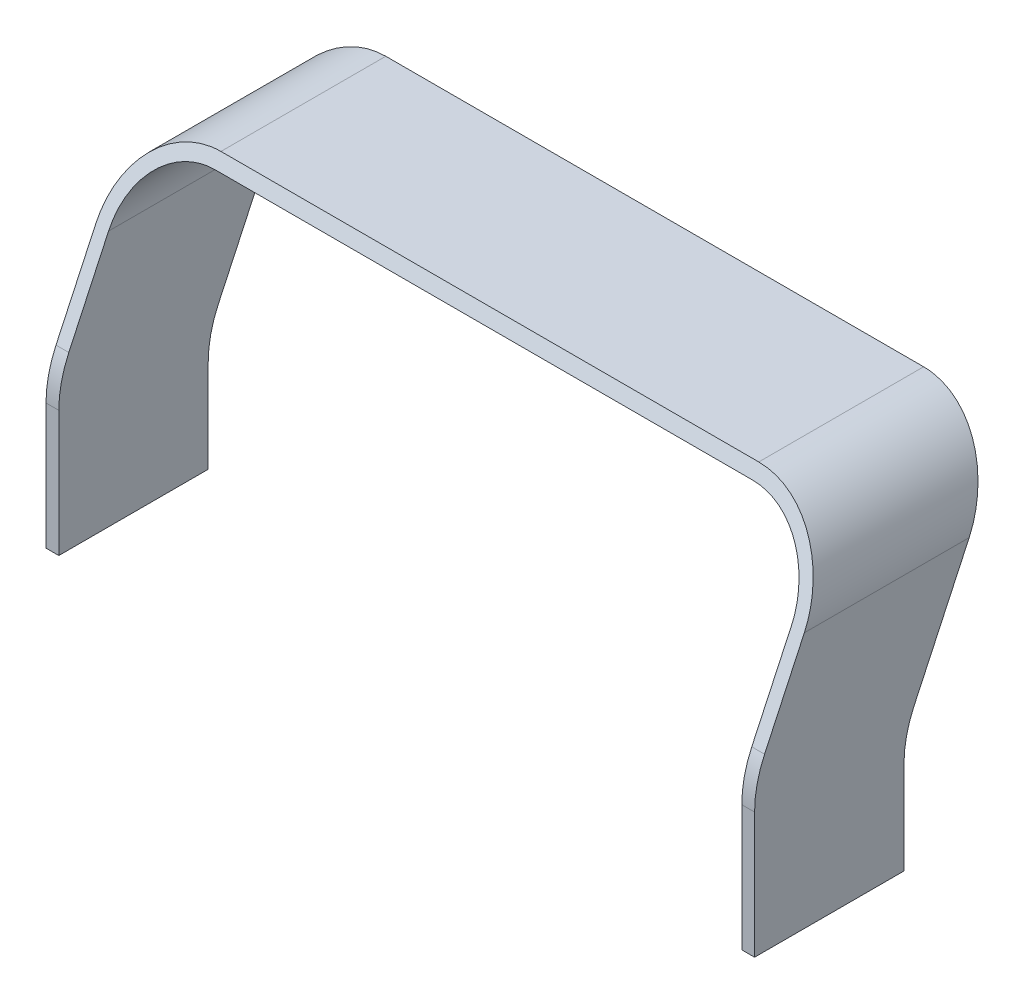
ISO-10303-21;
HEADER;
FILE_DESCRIPTION(('STEP AP214'),'2;1');
FILE_NAME('part.step','',(''),(''),'','','');
FILE_SCHEMA(('AUTOMOTIVE_DESIGN { 1 0 10303 214 1 1 1 1 }'));
ENDSEC;
DATA;
#1=APPLICATION_CONTEXT('core data for automotive mechanical design processes');
#2=APPLICATION_PROTOCOL_DEFINITION('international standard','automotive_design',2000,#1);
#3=PRODUCT_CONTEXT('',#1,'mechanical');
#4=PRODUCT('Part','Part','',(#3));
#5=PRODUCT_RELATED_PRODUCT_CATEGORY('part','',(#4));
#6=PRODUCT_DEFINITION_FORMATION('','',#4);
#7=PRODUCT_DEFINITION_CONTEXT('part definition',#1,'design');
#8=PRODUCT_DEFINITION('design','',#6,#7);
#9=PRODUCT_DEFINITION_SHAPE('','',#8);
#10=(LENGTH_UNIT() NAMED_UNIT(*) SI_UNIT(.MILLI.,.METRE.));
#11=(NAMED_UNIT(*) PLANE_ANGLE_UNIT() SI_UNIT($,.RADIAN.));
#12=(NAMED_UNIT(*) SI_UNIT($,.STERADIAN.) SOLID_ANGLE_UNIT());
#13=UNCERTAINTY_MEASURE_WITH_UNIT(LENGTH_MEASURE(1.E-05),#10,'distance_accuracy_value','');
#14=(GEOMETRIC_REPRESENTATION_CONTEXT(3) GLOBAL_UNCERTAINTY_ASSIGNED_CONTEXT((#13)) GLOBAL_UNIT_ASSIGNED_CONTEXT((#10,
#11,#12)) REPRESENTATION_CONTEXT('',''));
#15=CARTESIAN_POINT('',(0.,0.,0.));
#16=DIRECTION('',(0.,0.,1.));
#17=DIRECTION('',(1.,0.,0.));
#18=AXIS2_PLACEMENT_3D('',#15,#16,#17);
#19=CARTESIAN_POINT('',(-63.,65.,70.));
#20=DIRECTION('',(0.,0.,-1.));
#21=DIRECTION('',(-1.,0.,0.));
#22=AXIS2_PLACEMENT_3D('',#19,#20,#21);
#23=CYLINDRICAL_SURFACE('',#22,17.);
#24=CARTESIAN_POINT('',(-63.,65.,28.2070418011814));
#25=DIRECTION('',(0.,0.,1.));
#26=DIRECTION('',(0.,-1.,0.));
#27=AXIS2_PLACEMENT_3D('',#24,#25,#26);
#28=CIRCLE('',#27,17.);
#29=CARTESIAN_POINT('',(-79.2913524074985,69.8571428571429,28.2070418011814));
#30=VERTEX_POINT('',#29);
#31=CARTESIAN_POINT('',(-63.,82.,28.2070418011814));
#32=VERTEX_POINT('',#31);
#33=EDGE_CURVE('E52',#30,#32,#28,.F.);
#34=ORIENTED_EDGE('',*,*,#33,.F.);
#35=DIRECTION('',(0.,0.,-1.));
#36=VECTOR('',#35,1.);
#37=CARTESIAN_POINT('',(-79.2913524074985,69.8571428571429,70.));
#38=LINE('',#37,#36);
#39=CARTESIAN_POINT('',(-79.2913524074985,69.8571428571429,31.2070418011814));
#40=VERTEX_POINT('',#39);
#41=EDGE_CURVE('E320',#30,#40,#38,.F.);
#42=ORIENTED_EDGE('',*,*,#41,.T.);
#43=CARTESIAN_POINT('',(-63.,65.,31.2070418011814));
#44=DIRECTION('',(0.,0.,-1.));
#45=DIRECTION('',(-1.,0.,0.));
#46=AXIS2_PLACEMENT_3D('',#43,#44,#45);
#47=CIRCLE('',#46,17.);
#48=CARTESIAN_POINT('',(-63.,82.,31.2070418011814));
#49=VERTEX_POINT('',#48);
#50=EDGE_CURVE('E59',#49,#40,#47,.F.);
#51=ORIENTED_EDGE('',*,*,#50,.F.);
#52=DIRECTION('',(0.,0.,-1.));
#53=VECTOR('',#52,1.);
#54=CARTESIAN_POINT('',(-63.,82.,70.));
#55=LINE('',#54,#53);
#56=CARTESIAN_POINT('',(-63.,82.,50.41507835749));
#57=VERTEX_POINT('',#56);
#58=EDGE_CURVE('E268',#57,#49,#55,.T.);
#59=ORIENTED_EDGE('',*,*,#58,.F.);
#60=CARTESIAN_POINT('',(-63.,65.,58.342308546125));
#61=DIRECTION('',(0.,-0.422618261740701,-0.906307787036649));
#62=DIRECTION('',(0.,0.906307787036649,-0.422618261740701));
#63=AXIS2_PLACEMENT_3D('',#60,#61,#62);
#64=ELLIPSE('',#63,18.7574246223624,17.);
#65=CARTESIAN_POINT('',(-80.,65.,58.342308546125));
#66=VERTEX_POINT('',#65);
#67=EDGE_CURVE('E377',#57,#66,#64,.F.);
#68=ORIENTED_EDGE('',*,*,#67,.T.);
#69=DIRECTION('',(0.,0.,-1.));
#70=VECTOR('',#69,1.);
#71=CARTESIAN_POINT('',(-80.,65.,70.));
#72=LINE('',#71,#70);
#73=CARTESIAN_POINT('',(-80.,65.,19.7240813824378));
#74=VERTEX_POINT('',#73);
#75=EDGE_CURVE('E271',#66,#74,#72,.T.);
#76=ORIENTED_EDGE('',*,*,#75,.T.);
#77=CARTESIAN_POINT('',(-63.,65.,19.7240813824377));
#78=DIRECTION('',(0.,0.422618261740701,0.906307787036649));
#79=DIRECTION('',(0.,0.906307787036649,-0.422618261740701));
#80=AXIS2_PLACEMENT_3D('',#77,#78,#79);
#81=ELLIPSE('',#80,18.7574246223624,17.);
#82=CARTESIAN_POINT('',(-63.,82.,11.7968511938027));
#83=VERTEX_POINT('',#82);
#84=EDGE_CURVE('E403',#74,#83,#81,.F.);
#85=ORIENTED_EDGE('',*,*,#84,.T.);
#86=EDGE_CURVE('E267',#32,#83,#55,.T.);
#87=ORIENTED_EDGE('',*,*,#86,.F.);
#88=EDGE_LOOP('',(#34,#42,#51,#59,#68,#76,#85,#87));
#89=FACE_BOUND('',#88,.T.);
#90=ADVANCED_FACE('F37',(#89),#23,.F.);
#91=CARTESIAN_POINT('',(-63.,82.,70.));
#92=DIRECTION('',(0.,1.,0.));
#93=DIRECTION('',(0.,0.,1.));
#94=AXIS2_PLACEMENT_3D('',#91,#92,#93);
#95=PLANE('',#94);
#96=DIRECTION('',(-1.,0.,0.));
#97=VECTOR('',#96,1.);
#98=CARTESIAN_POINT('',(-63.,82.,31.2070418011814));
#99=LINE('',#98,#97);
#100=CARTESIAN_POINT('',(63.0000000000003,82.,31.2070418011814));
#101=VERTEX_POINT('',#100);
#102=EDGE_CURVE('E338',#101,#49,#99,.T.);
#103=ORIENTED_EDGE('',*,*,#102,.F.);
#104=DIRECTION('',(0.,0.,-1.));
#105=VECTOR('',#104,1.);
#106=CARTESIAN_POINT('',(63.0000000000003,82.,70.));
#107=LINE('',#106,#105);
#108=CARTESIAN_POINT('',(63.0000000000003,82.,50.41507835749));
#109=VERTEX_POINT('',#108);
#110=EDGE_CURVE('E264',#109,#101,#107,.T.);
#111=ORIENTED_EDGE('',*,*,#110,.F.);
#112=DIRECTION('',(-1.,0.,0.));
#113=VECTOR('',#112,1.);
#114=CARTESIAN_POINT('',(-63.,82.,50.41507835749));
#115=LINE('',#114,#113);
#116=EDGE_CURVE('E344',#109,#57,#115,.T.);
#117=ORIENTED_EDGE('',*,*,#116,.T.);
#118=ORIENTED_EDGE('',*,*,#58,.T.);
#119=EDGE_LOOP('',(#103,#111,#117,#118));
#120=FACE_BOUND('',#119,.T.);
#121=ADVANCED_FACE('F342',(#120),#95,.F.);
#122=DIRECTION('',(1.,0.,0.));
#123=VECTOR('',#122,1.);
#124=CARTESIAN_POINT('',(-63.,82.,28.2070418011814));
#125=LINE('',#124,#123);
#126=CARTESIAN_POINT('',(63.0000000000003,82.,28.2070418011813));
#127=VERTEX_POINT('',#126);
#128=EDGE_CURVE('E484',#32,#127,#125,.T.);
#129=ORIENTED_EDGE('',*,*,#128,.F.);
#130=ORIENTED_EDGE('',*,*,#86,.T.);
#131=DIRECTION('',(1.,0.,0.));
#132=VECTOR('',#131,1.);
#133=CARTESIAN_POINT('',(-63.,82.,11.7968511938027));
#134=LINE('',#133,#132);
#135=CARTESIAN_POINT('',(63.0000000000003,82.,11.7968511938027));
#136=VERTEX_POINT('',#135);
#137=EDGE_CURVE('E400',#83,#136,#134,.T.);
#138=ORIENTED_EDGE('',*,*,#137,.T.);
#139=EDGE_CURVE('E263',#127,#136,#107,.T.);
#140=ORIENTED_EDGE('',*,*,#139,.F.);
#141=EDGE_LOOP('',(#129,#130,#138,#140));
#142=FACE_BOUND('',#141,.T.);
#143=ADVANCED_FACE('F483',(#142),#95,.F.);
#144=CARTESIAN_POINT('',(63.0000000000003,65.,70.));
#145=DIRECTION('',(0.,0.,-1.));
#146=DIRECTION('',(-1.,0.,0.));
#147=AXIS2_PLACEMENT_3D('',#144,#145,#146);
#148=CYLINDRICAL_SURFACE('',#147,17.);
#149=CARTESIAN_POINT('',(63.0000000000003,65.,31.2070418011814));
#150=DIRECTION('',(0.,0.,-1.));
#151=DIRECTION('',(-1.,0.,0.));
#152=AXIS2_PLACEMENT_3D('',#149,#150,#151);
#153=CIRCLE('',#152,17.);
#154=CARTESIAN_POINT('',(79.2913524074987,69.8571428571429,31.2070418011814));
#155=VERTEX_POINT('',#154);
#156=EDGE_CURVE('E347',#155,#101,#153,.F.);
#157=ORIENTED_EDGE('',*,*,#156,.F.);
#158=DIRECTION('',(0.,0.,-1.));
#159=VECTOR('',#158,1.);
#160=CARTESIAN_POINT('',(79.2913524074987,69.8571428571429,70.));
#161=LINE('',#160,#159);
#162=CARTESIAN_POINT('',(79.2913524074987,69.8571428571429,28.2070418011814));
#163=VERTEX_POINT('',#162);
#164=EDGE_CURVE('E317',#155,#163,#161,.T.);
#165=ORIENTED_EDGE('',*,*,#164,.T.);
#166=CARTESIAN_POINT('',(63.0000000000003,65.,28.2070418011814));
#167=DIRECTION('',(0.,0.,1.));
#168=DIRECTION('',(0.,-1.,0.));
#169=AXIS2_PLACEMENT_3D('',#166,#167,#168);
#170=CIRCLE('',#169,17.);
#171=EDGE_CURVE('E530',#127,#163,#170,.F.);
#172=ORIENTED_EDGE('',*,*,#171,.F.);
#173=ORIENTED_EDGE('',*,*,#139,.T.);
#174=CARTESIAN_POINT('',(63.0000000000003,65.,19.7240813824378));
#175=DIRECTION('',(0.,0.422618261740701,0.906307787036649));
#176=DIRECTION('',(0.,0.906307787036649,-0.422618261740701));
#177=AXIS2_PLACEMENT_3D('',#174,#175,#176);
#178=ELLIPSE('',#177,18.7574246223624,17.);
#179=CARTESIAN_POINT('',(80.0000000000003,65.,19.7240813824378));
#180=VERTEX_POINT('',#179);
#181=EDGE_CURVE('E397',#136,#180,#178,.F.);
#182=ORIENTED_EDGE('',*,*,#181,.T.);
#183=DIRECTION('',(0.,0.,-1.));
#184=VECTOR('',#183,1.);
#185=CARTESIAN_POINT('',(80.0000000000003,65.,70.));
#186=LINE('',#185,#184);
#187=CARTESIAN_POINT('',(80.0000000000003,65.,58.342308546125));
#188=VERTEX_POINT('',#187);
#189=EDGE_CURVE('E260',#188,#180,#186,.T.);
#190=ORIENTED_EDGE('',*,*,#189,.F.);
#191=CARTESIAN_POINT('',(63.0000000000003,65.,58.342308546125));
#192=DIRECTION('',(0.,-0.422618261740701,-0.906307787036649));
#193=DIRECTION('',(0.,0.906307787036649,-0.422618261740701));
#194=AXIS2_PLACEMENT_3D('',#191,#192,#193);
#195=ELLIPSE('',#194,18.7574246223624,17.);
#196=EDGE_CURVE('E373',#188,#109,#195,.F.);
#197=ORIENTED_EDGE('',*,*,#196,.T.);
#198=ORIENTED_EDGE('',*,*,#110,.T.);
#199=EDGE_LOOP('',(#157,#165,#172,#173,#182,#190,#197,#198));
#200=FACE_BOUND('',#199,.T.);
#201=ADVANCED_FACE('F477',(#200),#148,.F.);
#202=CARTESIAN_POINT('',(-63.,65.,70.));
#203=DIRECTION('',(0.,0.,-1.));
#204=DIRECTION('',(-1.,0.,0.));
#205=AXIS2_PLACEMENT_3D('',#202,#203,#204);
#206=PLANE('',#205);
#207=DIRECTION('',(0.,1.,0.));
#208=VECTOR('',#207,1.);
#209=CARTESIAN_POINT('',(83.0000000000003,64.9999999999999,70.));
#210=LINE('',#209,#208);
#211=CARTESIAN_POINT('',(83.0000000000003,5.,70.));
#212=VERTEX_POINT('',#211);
#213=CARTESIAN_POINT('',(83.0000000000003,34.4576334339265,70.));
#214=VERTEX_POINT('',#213);
#215=EDGE_CURVE('E418',#212,#214,#210,.T.);
#216=ORIENTED_EDGE('',*,*,#215,.T.);
#217=DIRECTION('',(-1.,0.,0.));
#218=VECTOR('',#217,1.);
#219=CARTESIAN_POINT('',(-63.,34.4576334339265,70.));
#220=LINE('',#219,#218);
#221=CARTESIAN_POINT('',(80.0000000000003,34.4576334339265,70.));
#222=VERTEX_POINT('',#221);
#223=EDGE_CURVE('E285',#214,#222,#220,.T.);
#224=ORIENTED_EDGE('',*,*,#223,.T.);
#225=DIRECTION('',(0.,-1.,0.));
#226=VECTOR('',#225,1.);
#227=CARTESIAN_POINT('',(80.0000000000003,65.,70.));
#228=LINE('',#227,#226);
#229=CARTESIAN_POINT('',(80.0000000000003,5.00000000000001,70.));
#230=VERTEX_POINT('',#229);
#231=EDGE_CURVE('E414',#222,#230,#228,.T.);
#232=ORIENTED_EDGE('',*,*,#231,.T.);
#233=DIRECTION('',(1.,0.,0.));
#234=VECTOR('',#233,1.);
#235=CARTESIAN_POINT('',(80.0000000000003,5.00000000000001,70.));
#236=LINE('',#235,#234);
#237=EDGE_CURVE('E416',#230,#212,#236,.T.);
#238=ORIENTED_EDGE('',*,*,#237,.T.);
#239=EDGE_LOOP('',(#216,#224,#232,#238));
#240=FACE_BOUND('',#239,.T.);
#241=ADVANCED_FACE('F468',(#240),#206,.F.);
#242=CARTESIAN_POINT('',(-83.,4.99999999999997,70.));
#243=DIRECTION('',(0.,1.,0.));
#244=DIRECTION('',(-1.,0.,0.));
#245=AXIS2_PLACEMENT_3D('',#242,#243,#244);
#246=PLANE('',#245);
#247=DIRECTION('',(0.,0.,-1.));
#248=VECTOR('',#247,1.);
#249=CARTESIAN_POINT('',(-83.,4.99999999999997,70.));
#250=LINE('',#249,#248);
#251=CARTESIAN_POINT('',(-83.,4.99999999999997,70.));
#252=VERTEX_POINT('',#251);
#253=CARTESIAN_POINT('',(-83.,4.99999999999997,35.));
#254=VERTEX_POINT('',#253);
#255=EDGE_CURVE('E241',#252,#254,#250,.T.);
#256=ORIENTED_EDGE('',*,*,#255,.T.);
#257=DIRECTION('',(1.,0.,0.));
#258=VECTOR('',#257,1.);
#259=CARTESIAN_POINT('',(-83.,4.99999999999997,35.));
#260=LINE('',#259,#258);
#261=CARTESIAN_POINT('',(-80.,5.00000000000001,35.));
#262=VERTEX_POINT('',#261);
#263=EDGE_CURVE('E234',#254,#262,#260,.T.);
#264=ORIENTED_EDGE('',*,*,#263,.T.);
#265=DIRECTION('',(0.,0.,-1.));
#266=VECTOR('',#265,1.);
#267=CARTESIAN_POINT('',(-80.,5.00000000000001,70.));
#268=LINE('',#267,#266);
#269=CARTESIAN_POINT('',(-80.,5.00000000000001,70.));
#270=VERTEX_POINT('',#269);
#271=EDGE_CURVE('E274',#270,#262,#268,.T.);
#272=ORIENTED_EDGE('',*,*,#271,.F.);
#273=DIRECTION('',(1.,0.,0.));
#274=VECTOR('',#273,1.);
#275=CARTESIAN_POINT('',(-83.,4.99999999999997,70.));
#276=LINE('',#275,#274);
#277=EDGE_CURVE('E408',#252,#270,#276,.T.);
#278=ORIENTED_EDGE('',*,*,#277,.F.);
#279=EDGE_LOOP('',(#256,#264,#272,#278));
#280=FACE_BOUND('',#279,.T.);
#281=ADVANCED_FACE('F428',(#280),#246,.F.);
#282=CARTESIAN_POINT('',(-80.,5.00000000000001,70.));
#283=DIRECTION('',(-1.,0.,0.));
#284=DIRECTION('',(0.,0.,1.));
#285=AXIS2_PLACEMENT_3D('',#282,#283,#284);
#286=PLANE('',#285);
#287=DIRECTION('',(0.,-0.906307787036649,0.422618261740701));
#288=VECTOR('',#287,1.);
#289=CARTESIAN_POINT('',(-80.,11.2512168304856,83.4057777545822));
#290=LINE('',#289,#288);
#291=CARTESIAN_POINT('',(-80.,45.023089977444,67.6576946759162));
#292=VERTEX_POINT('',#291);
#293=EDGE_CURVE('E379',#66,#292,#290,.T.);
#294=ORIENTED_EDGE('',*,*,#293,.T.);
#295=CARTESIAN_POINT('',(-80.,34.4576334339265,45.));
#296=DIRECTION('',(-1.,0.,0.));
#297=DIRECTION('',(0.,0.,1.));
#298=AXIS2_PLACEMENT_3D('',#295,#296,#297);
#299=CIRCLE('',#298,25.);
#300=CARTESIAN_POINT('',(-80.,34.4576334339265,70.));
#301=VERTEX_POINT('',#300);
#302=EDGE_CURVE('E301',#292,#301,#299,.F.);
#303=ORIENTED_EDGE('',*,*,#302,.T.);
#304=DIRECTION('',(0.,1.,0.));
#305=VECTOR('',#304,1.);
#306=CARTESIAN_POINT('',(-80.,5.00000000000001,70.));
#307=LINE('',#306,#305);
#308=EDGE_CURVE('E411',#270,#301,#307,.T.);
#309=ORIENTED_EDGE('',*,*,#308,.F.);
#310=ORIENTED_EDGE('',*,*,#271,.T.);
#311=DIRECTION('',(0.,1.,0.));
#312=VECTOR('',#311,1.);
#313=CARTESIAN_POINT('',(-80.,5.00000000000001,35.));
#314=LINE('',#313,#312);
#315=CARTESIAN_POINT('',(-80.,26.6983202414236,35.));
#316=VERTEX_POINT('',#315);
#317=EDGE_CURVE('E387',#262,#316,#314,.T.);
#318=ORIENTED_EDGE('',*,*,#317,.T.);
#319=CARTESIAN_POINT('',(-80.,26.6983202414236,10.));
#320=DIRECTION('',(-1.,0.,0.));
#321=DIRECTION('',(0.,0.,1.));
#322=AXIS2_PLACEMENT_3D('',#319,#320,#321);
#323=CIRCLE('',#322,25.);
#324=CARTESIAN_POINT('',(-80.,37.2637767849411,32.6576946759162));
#325=VERTEX_POINT('',#324);
#326=EDGE_CURVE('E309',#316,#325,#323,.T.);
#327=ORIENTED_EDGE('',*,*,#326,.T.);
#328=DIRECTION('',(0.,0.906307787036649,-0.422618261740701));
#329=VECTOR('',#328,1.);
#330=CARTESIAN_POINT('',(-80.,-3.54042233043891,51.6850052082995));
#331=LINE('',#330,#329);
#332=EDGE_CURVE('E406',#325,#74,#331,.T.);
#333=ORIENTED_EDGE('',*,*,#332,.T.);
#334=ORIENTED_EDGE('',*,*,#75,.F.);
#335=EDGE_LOOP('',(#294,#303,#309,#310,#318,#327,#333,#334));
#336=FACE_BOUND('',#335,.T.);
#337=ADVANCED_FACE('F430',(#336),#286,.F.);
#338=CARTESIAN_POINT('',(80.0000000000003,65.,70.));
#339=DIRECTION('',(1.,0.,0.));
#340=DIRECTION('',(0.,1.,0.));
#341=AXIS2_PLACEMENT_3D('',#338,#339,#340);
#342=PLANE('',#341);
#343=ORIENTED_EDGE('',*,*,#231,.F.);
#344=CARTESIAN_POINT('',(80.0000000000003,34.4576334339265,45.));
#345=DIRECTION('',(1.,0.,0.));
#346=DIRECTION('',(0.,1.,0.));
#347=AXIS2_PLACEMENT_3D('',#344,#345,#346);
#348=CIRCLE('',#347,25.);
#349=CARTESIAN_POINT('',(80.0000000000003,45.023089977444,67.6576946759162));
#350=VERTEX_POINT('',#349);
#351=EDGE_CURVE('E288',#222,#350,#348,.F.);
#352=ORIENTED_EDGE('',*,*,#351,.T.);
#353=DIRECTION('',(0.,0.906307787036649,-0.422618261740701));
#354=VECTOR('',#353,1.);
#355=CARTESIAN_POINT('',(80.0000000000003,60.5348451210817,60.4244444610128));
#356=LINE('',#355,#354);
#357=EDGE_CURVE('E371',#350,#188,#356,.T.);
#358=ORIENTED_EDGE('',*,*,#357,.T.);
#359=ORIENTED_EDGE('',*,*,#189,.T.);
#360=DIRECTION('',(0.,-0.906307787036649,0.422618261740701));
#361=VECTOR('',#360,1.);
#362=CARTESIAN_POINT('',(80.0000000000003,45.7432059601572,28.70367191473));
#363=LINE('',#362,#361);
#364=CARTESIAN_POINT('',(80.0000000000003,37.2637767849411,32.6576946759162));
#365=VERTEX_POINT('',#364);
#366=EDGE_CURVE('E394',#180,#365,#363,.T.);
#367=ORIENTED_EDGE('',*,*,#366,.T.);
#368=CARTESIAN_POINT('',(80.0000000000003,26.6983202414236,10.));
#369=DIRECTION('',(1.,0.,0.));
#370=DIRECTION('',(0.,1.,0.));
#371=AXIS2_PLACEMENT_3D('',#368,#369,#370);
#372=CIRCLE('',#371,25.);
#373=CARTESIAN_POINT('',(80.0000000000003,26.6983202414236,35.));
#374=VERTEX_POINT('',#373);
#375=EDGE_CURVE('E303',#365,#374,#372,.T.);
#376=ORIENTED_EDGE('',*,*,#375,.T.);
#377=DIRECTION('',(0.,-1.,0.));
#378=VECTOR('',#377,1.);
#379=CARTESIAN_POINT('',(80.0000000000003,65.,35.));
#380=LINE('',#379,#378);
#381=CARTESIAN_POINT('',(80.0000000000003,5.00000000000001,35.));
#382=VERTEX_POINT('',#381);
#383=EDGE_CURVE('E385',#374,#382,#380,.T.);
#384=ORIENTED_EDGE('',*,*,#383,.T.);
#385=DIRECTION('',(0.,0.,-1.));
#386=VECTOR('',#385,1.);
#387=CARTESIAN_POINT('',(80.0000000000003,5.00000000000001,70.));
#388=LINE('',#387,#386);
#389=EDGE_CURVE('E257',#230,#382,#388,.T.);
#390=ORIENTED_EDGE('',*,*,#389,.F.);
#391=EDGE_LOOP('',(#343,#352,#358,#359,#367,#376,#384,#390));
#392=FACE_BOUND('',#391,.T.);
#393=ADVANCED_FACE('F458',(#392),#342,.F.);
#394=CARTESIAN_POINT('',(80.0000000000003,5.00000000000001,70.));
#395=DIRECTION('',(0.,1.,0.));
#396=DIRECTION('',(-1.,0.,0.));
#397=AXIS2_PLACEMENT_3D('',#394,#395,#396);
#398=PLANE('',#397);
#399=ORIENTED_EDGE('',*,*,#389,.T.);
#400=DIRECTION('',(1.,0.,0.));
#401=VECTOR('',#400,1.);
#402=CARTESIAN_POINT('',(80.0000000000003,5.00000000000001,35.));
#403=LINE('',#402,#401);
#404=CARTESIAN_POINT('',(83.0000000000003,5.,35.));
#405=VERTEX_POINT('',#404);
#406=EDGE_CURVE('E382',#382,#405,#403,.T.);
#407=ORIENTED_EDGE('',*,*,#406,.T.);
#408=DIRECTION('',(0.,0.,-1.));
#409=VECTOR('',#408,1.);
#410=CARTESIAN_POINT('',(83.0000000000003,5.,70.));
#411=LINE('',#410,#409);
#412=EDGE_CURVE('E254',#212,#405,#411,.T.);
#413=ORIENTED_EDGE('',*,*,#412,.F.);
#414=ORIENTED_EDGE('',*,*,#237,.F.);
#415=EDGE_LOOP('',(#399,#407,#413,#414));
#416=FACE_BOUND('',#415,.T.);
#417=ADVANCED_FACE('F466',(#416),#398,.F.);
#418=CARTESIAN_POINT('',(83.0000000000003,64.9999999999999,70.));
#419=DIRECTION('',(-1.,0.,0.));
#420=DIRECTION('',(0.,-1.,0.));
#421=AXIS2_PLACEMENT_3D('',#418,#419,#420);
#422=PLANE('',#421);
#423=DIRECTION('',(0.,-0.906307787036649,0.422618261740701));
#424=VECTOR('',#423,1.);
#425=CARTESIAN_POINT('',(83.0000000000003,85.,49.016155383025));
#426=LINE('',#425,#424);
#427=CARTESIAN_POINT('',(83.0000000000003,65.,58.342308546125));
#428=VERTEX_POINT('',#427);
#429=CARTESIAN_POINT('',(83.0000000000003,45.023089977444,67.6576946759162));
#430=VERTEX_POINT('',#429);
#431=EDGE_CURVE('E352',#428,#430,#426,.T.);
#432=ORIENTED_EDGE('',*,*,#431,.T.);
#433=CARTESIAN_POINT('',(83.0000000000003,34.4576334339265,45.));
#434=DIRECTION('',(-1.,0.,0.));
#435=DIRECTION('',(0.,-1.,0.));
#436=AXIS2_PLACEMENT_3D('',#433,#434,#435);
#437=CIRCLE('',#436,25.);
#438=EDGE_CURVE('E294',#430,#214,#437,.F.);
#439=ORIENTED_EDGE('',*,*,#438,.T.);
#440=ORIENTED_EDGE('',*,*,#215,.F.);
#441=ORIENTED_EDGE('',*,*,#412,.T.);
#442=DIRECTION('',(0.,1.,0.));
#443=VECTOR('',#442,1.);
#444=CARTESIAN_POINT('',(83.0000000000003,32.2406868074971,35.));
#445=LINE('',#444,#443);
#446=CARTESIAN_POINT('',(83.0000000000003,26.6983202414236,35.));
#447=VERTEX_POINT('',#446);
#448=EDGE_CURVE('E223',#405,#447,#445,.T.);
#449=ORIENTED_EDGE('',*,*,#448,.T.);
#450=CARTESIAN_POINT('',(83.0000000000003,26.6983202414236,10.));
#451=DIRECTION('',(-1.,0.,0.));
#452=DIRECTION('',(0.,-1.,0.));
#453=AXIS2_PLACEMENT_3D('',#450,#451,#452);
#454=CIRCLE('',#453,25.);
#455=CARTESIAN_POINT('',(83.0000000000003,37.2637767849411,32.6576946759162));
#456=VERTEX_POINT('',#455);
#457=EDGE_CURVE('E305',#447,#456,#454,.T.);
#458=ORIENTED_EDGE('',*,*,#457,.T.);
#459=DIRECTION('',(0.,0.906307787036649,-0.422618261740701));
#460=VECTOR('',#459,1.);
#461=CARTESIAN_POINT('',(83.0000000000003,85.,10.3979282193377));
#462=LINE('',#461,#460);
#463=CARTESIAN_POINT('',(83.0000000000003,65.,19.7240813824378));
#464=VERTEX_POINT('',#463);
#465=EDGE_CURVE('E362',#456,#464,#462,.T.);
#466=ORIENTED_EDGE('',*,*,#465,.T.);
#467=DIRECTION('',(0.,0.,-1.));
#468=VECTOR('',#467,1.);
#469=CARTESIAN_POINT('',(83.0000000000003,64.9999999999999,70.));
#470=LINE('',#469,#468);
#471=EDGE_CURVE('E251',#428,#464,#470,.T.);
#472=ORIENTED_EDGE('',*,*,#471,.F.);
#473=EDGE_LOOP('',(#432,#439,#440,#441,#449,#458,#466,#472));
#474=FACE_BOUND('',#473,.T.);
#475=ADVANCED_FACE('F448',(#474),#422,.F.);
#476=CARTESIAN_POINT('',(63.0000000000003,65.,70.));
#477=DIRECTION('',(0.,0.,-1.));
#478=DIRECTION('',(-1.,0.,0.));
#479=AXIS2_PLACEMENT_3D('',#476,#477,#478);
#480=CYLINDRICAL_SURFACE('',#479,20.);
#481=CARTESIAN_POINT('',(63.0000000000003,65.,19.7240813824378));
#482=DIRECTION('',(0.,0.422618261740701,0.906307787036649));
#483=DIRECTION('',(0.,0.906307787036649,-0.422618261740701));
#484=AXIS2_PLACEMENT_3D('',#481,#482,#483);
#485=ELLIPSE('',#484,22.0675583792499,20.);
#486=CARTESIAN_POINT('',(63.0000000000001,85.,10.3979282193377));
#487=VERTEX_POINT('',#486);
#488=EDGE_CURVE('E233',#464,#487,#485,.T.);
#489=ORIENTED_EDGE('',*,*,#488,.T.);
#490=DIRECTION('',(0.,0.,-1.));
#491=VECTOR('',#490,1.);
#492=CARTESIAN_POINT('',(63.0000000000001,85.,70.));
#493=LINE('',#492,#491);
#494=CARTESIAN_POINT('',(63.0000000000001,85.,49.016155383025));
#495=VERTEX_POINT('',#494);
#496=EDGE_CURVE('E243',#495,#487,#493,.T.);
#497=ORIENTED_EDGE('',*,*,#496,.F.);
#498=CARTESIAN_POINT('',(63.0000000000003,65.,58.342308546125));
#499=DIRECTION('',(0.,-0.422618261740701,-0.906307787036649));
#500=DIRECTION('',(0.,0.906307787036649,-0.422618261740701));
#501=AXIS2_PLACEMENT_3D('',#498,#499,#500);
#502=ELLIPSE('',#501,22.0675583792499,20.);
#503=EDGE_CURVE('E368',#495,#428,#502,.T.);
#504=ORIENTED_EDGE('',*,*,#503,.T.);
#505=ORIENTED_EDGE('',*,*,#471,.T.);
#506=EDGE_LOOP('',(#489,#497,#504,#505));
#507=FACE_BOUND('',#506,.T.);
#508=ADVANCED_FACE('F445',(#507),#480,.T.);
#509=CARTESIAN_POINT('',(-62.9999999999999,85.,70.));
#510=DIRECTION('',(0.,-1.,0.));
#511=DIRECTION('',(0.,0.,-1.));
#512=AXIS2_PLACEMENT_3D('',#509,#510,#511);
#513=PLANE('',#512);
#514=DIRECTION('',(-1.,0.,0.));
#515=VECTOR('',#514,1.);
#516=CARTESIAN_POINT('',(83.0000000000003,85.,10.3979282193377));
#517=LINE('',#516,#515);
#518=CARTESIAN_POINT('',(-63.,85.,10.3979282193377));
#519=VERTEX_POINT('',#518);
#520=EDGE_CURVE('E357',#487,#519,#517,.T.);
#521=ORIENTED_EDGE('',*,*,#520,.T.);
#522=DIRECTION('',(0.,0.,-1.));
#523=VECTOR('',#522,1.);
#524=CARTESIAN_POINT('',(-62.9999999999999,85.,70.));
#525=LINE('',#524,#523);
#526=CARTESIAN_POINT('',(-63.,85.,49.016155383025));
#527=VERTEX_POINT('',#526);
#528=EDGE_CURVE('E232',#527,#519,#525,.T.);
#529=ORIENTED_EDGE('',*,*,#528,.F.);
#530=DIRECTION('',(-1.,0.,0.));
#531=VECTOR('',#530,1.);
#532=CARTESIAN_POINT('',(83.0000000000003,85.,49.016155383025));
#533=LINE('',#532,#531);
#534=EDGE_CURVE('E355',#495,#527,#533,.T.);
#535=ORIENTED_EDGE('',*,*,#534,.F.);
#536=ORIENTED_EDGE('',*,*,#496,.T.);
#537=EDGE_LOOP('',(#521,#529,#535,#536));
#538=FACE_BOUND('',#537,.T.);
#539=ADVANCED_FACE('F441',(#538),#513,.F.);
#540=CARTESIAN_POINT('',(-63.,65.,70.));
#541=DIRECTION('',(0.,0.,-1.));
#542=DIRECTION('',(-1.,0.,0.));
#543=AXIS2_PLACEMENT_3D('',#540,#541,#542);
#544=CYLINDRICAL_SURFACE('',#543,20.);
#545=ORIENTED_EDGE('',*,*,#528,.T.);
#546=CARTESIAN_POINT('',(-63.,65.,19.7240813824377));
#547=DIRECTION('',(0.,0.422618261740701,0.906307787036649));
#548=DIRECTION('',(0.,0.906307787036649,-0.422618261740701));
#549=AXIS2_PLACEMENT_3D('',#546,#547,#548);
#550=ELLIPSE('',#549,22.0675583792498,20.);
#551=CARTESIAN_POINT('',(-83.,64.9999999999999,19.7240813824378));
#552=VERTEX_POINT('',#551);
#553=EDGE_CURVE('E216',#519,#552,#550,.T.);
#554=ORIENTED_EDGE('',*,*,#553,.T.);
#555=DIRECTION('',(0.,0.,-1.));
#556=VECTOR('',#555,1.);
#557=CARTESIAN_POINT('',(-83.,64.9999999999999,70.));
#558=LINE('',#557,#556);
#559=CARTESIAN_POINT('',(-83.,64.9999999999999,58.3423085461251));
#560=VERTEX_POINT('',#559);
#561=EDGE_CURVE('E230',#560,#552,#558,.T.);
#562=ORIENTED_EDGE('',*,*,#561,.F.);
#563=CARTESIAN_POINT('',(-63.,65.,58.342308546125));
#564=DIRECTION('',(0.,-0.422618261740701,-0.906307787036649));
#565=DIRECTION('',(0.,0.906307787036649,-0.422618261740701));
#566=AXIS2_PLACEMENT_3D('',#563,#564,#565);
#567=ELLIPSE('',#566,22.0675583792498,20.);
#568=EDGE_CURVE('E359',#560,#527,#567,.T.);
#569=ORIENTED_EDGE('',*,*,#568,.T.);
#570=EDGE_LOOP('',(#545,#554,#562,#569));
#571=FACE_BOUND('',#570,.T.);
#572=ADVANCED_FACE('F228',(#571),#544,.T.);
#573=CARTESIAN_POINT('',(-83.,4.99999999999997,70.));
#574=DIRECTION('',(1.,0.,0.));
#575=DIRECTION('',(0.,0.,-1.));
#576=AXIS2_PLACEMENT_3D('',#573,#574,#575);
#577=PLANE('',#576);
#578=DIRECTION('',(0.,-1.,0.));
#579=VECTOR('',#578,1.);
#580=CARTESIAN_POINT('',(-83.,4.99999999999997,70.));
#581=LINE('',#580,#579);
#582=CARTESIAN_POINT('',(-83.,34.4576334339265,70.));
#583=VERTEX_POINT('',#582);
#584=EDGE_CURVE('E246',#583,#252,#581,.T.);
#585=ORIENTED_EDGE('',*,*,#584,.F.);
#586=CARTESIAN_POINT('',(-83.,34.4576334339265,45.));
#587=DIRECTION('',(1.,0.,0.));
#588=DIRECTION('',(0.,0.,-1.));
#589=AXIS2_PLACEMENT_3D('',#586,#587,#588);
#590=CIRCLE('',#589,25.);
#591=CARTESIAN_POINT('',(-83.,45.023089977444,67.6576946759162));
#592=VERTEX_POINT('',#591);
#593=EDGE_CURVE('E299',#583,#592,#590,.F.);
#594=ORIENTED_EDGE('',*,*,#593,.T.);
#595=DIRECTION('',(0.,-0.906307787036649,0.422618261740701));
#596=VECTOR('',#595,1.);
#597=CARTESIAN_POINT('',(-83.,85.,49.016155383025));
#598=LINE('',#597,#596);
#599=EDGE_CURVE('E240',#560,#592,#598,.T.);
#600=ORIENTED_EDGE('',*,*,#599,.F.);
#601=ORIENTED_EDGE('',*,*,#561,.T.);
#602=DIRECTION('',(0.,0.906307787036649,-0.422618261740701));
#603=VECTOR('',#602,1.);
#604=CARTESIAN_POINT('',(-83.,85.,10.3979282193377));
#605=LINE('',#604,#603);
#606=CARTESIAN_POINT('',(-83.,37.2637767849411,32.6576946759162));
#607=VERTEX_POINT('',#606);
#608=EDGE_CURVE('E211',#607,#552,#605,.T.);
#609=ORIENTED_EDGE('',*,*,#608,.F.);
#610=CARTESIAN_POINT('',(-83.,26.6983202414236,10.));
#611=DIRECTION('',(1.,0.,0.));
#612=DIRECTION('',(0.,0.,-1.));
#613=AXIS2_PLACEMENT_3D('',#610,#611,#612);
#614=CIRCLE('',#613,25.);
#615=CARTESIAN_POINT('',(-83.,26.6983202414236,35.));
#616=VERTEX_POINT('',#615);
#617=EDGE_CURVE('E307',#607,#616,#614,.T.);
#618=ORIENTED_EDGE('',*,*,#617,.T.);
#619=DIRECTION('',(0.,1.,0.));
#620=VECTOR('',#619,1.);
#621=CARTESIAN_POINT('',(-83.,32.2406868074971,35.));
#622=LINE('',#621,#620);
#623=EDGE_CURVE('E224',#254,#616,#622,.T.);
#624=ORIENTED_EDGE('',*,*,#623,.F.);
#625=ORIENTED_EDGE('',*,*,#255,.F.);
#626=EDGE_LOOP('',(#585,#594,#600,#601,#609,#618,#624,#625));
#627=FACE_BOUND('',#626,.T.);
#628=ADVANCED_FACE('F238',(#627),#577,.F.);
#629=ORIENTED_EDGE('',*,*,#308,.T.);
#630=DIRECTION('',(-1.,0.,0.));
#631=VECTOR('',#630,1.);
#632=CARTESIAN_POINT('',(-63.,34.4576334339265,70.));
#633=LINE('',#632,#631);
#634=EDGE_CURVE('E296',#301,#583,#633,.T.);
#635=ORIENTED_EDGE('',*,*,#634,.T.);
#636=ORIENTED_EDGE('',*,*,#584,.T.);
#637=ORIENTED_EDGE('',*,*,#277,.T.);
#638=EDGE_LOOP('',(#629,#635,#636,#637));
#639=FACE_BOUND('',#638,.T.);
#640=ADVANCED_FACE('F422',(#639),#206,.F.);
#641=CARTESIAN_POINT('',(83.0000000000003,85.,49.016155383025));
#642=DIRECTION('',(0.,-0.422618261740701,-0.906307787036649));
#643=DIRECTION('',(0.,0.906307787036649,-0.422618261740701));
#644=AXIS2_PLACEMENT_3D('',#641,#642,#643);
#645=PLANE('',#644);
#646=ORIENTED_EDGE('',*,*,#357,.F.);
#647=DIRECTION('',(-1.,0.,0.));
#648=VECTOR('',#647,1.);
#649=CARTESIAN_POINT('',(83.0000000000003,45.023089977444,67.6576946759162));
#650=LINE('',#649,#648);
#651=EDGE_CURVE('E292',#350,#430,#650,.F.);
#652=ORIENTED_EDGE('',*,*,#651,.T.);
#653=ORIENTED_EDGE('',*,*,#431,.F.);
#654=ORIENTED_EDGE('',*,*,#503,.F.);
#655=ORIENTED_EDGE('',*,*,#534,.T.);
#656=ORIENTED_EDGE('',*,*,#568,.F.);
#657=ORIENTED_EDGE('',*,*,#599,.T.);
#658=DIRECTION('',(-1.,0.,0.));
#659=VECTOR('',#658,1.);
#660=CARTESIAN_POINT('',(83.0000000000003,45.023089977444,67.6576946759162));
#661=LINE('',#660,#659);
#662=EDGE_CURVE('E290',#592,#292,#661,.F.);
#663=ORIENTED_EDGE('',*,*,#662,.T.);
#664=ORIENTED_EDGE('',*,*,#293,.F.);
#665=ORIENTED_EDGE('',*,*,#67,.F.);
#666=ORIENTED_EDGE('',*,*,#116,.F.);
#667=ORIENTED_EDGE('',*,*,#196,.F.);
#668=EDGE_LOOP('',(#646,#652,#653,#654,#655,#656,#657,#663,#664,#665,#666,#667));
#669=FACE_BOUND('',#668,.T.);
#670=ADVANCED_FACE('F438',(#669),#645,.F.);
#671=CARTESIAN_POINT('',(83.0000000000003,85.,10.3979282193377));
#672=DIRECTION('',(0.,0.422618261740701,0.906307787036649));
#673=DIRECTION('',(0.,-0.906307787036649,0.422618261740701));
#674=AXIS2_PLACEMENT_3D('',#671,#672,#673);
#675=PLANE('',#674);
#676=ORIENTED_EDGE('',*,*,#465,.F.);
#677=DIRECTION('',(-1.,0.,0.));
#678=VECTOR('',#677,1.);
#679=CARTESIAN_POINT('',(80.0000000000003,37.2637767849411,32.6576946759162));
#680=LINE('',#679,#678);
#681=EDGE_CURVE('E278',#456,#365,#680,.T.);
#682=ORIENTED_EDGE('',*,*,#681,.T.);
#683=ORIENTED_EDGE('',*,*,#366,.F.);
#684=ORIENTED_EDGE('',*,*,#181,.F.);
#685=ORIENTED_EDGE('',*,*,#137,.F.);
#686=ORIENTED_EDGE('',*,*,#84,.F.);
#687=ORIENTED_EDGE('',*,*,#332,.F.);
#688=DIRECTION('',(-1.,0.,0.));
#689=VECTOR('',#688,1.);
#690=CARTESIAN_POINT('',(-82.9999999999999,37.2637767849411,32.6576946759162));
#691=LINE('',#690,#689);
#692=EDGE_CURVE('E220',#325,#607,#691,.T.);
#693=ORIENTED_EDGE('',*,*,#692,.T.);
#694=ORIENTED_EDGE('',*,*,#608,.T.);
#695=ORIENTED_EDGE('',*,*,#553,.F.);
#696=ORIENTED_EDGE('',*,*,#520,.F.);
#697=ORIENTED_EDGE('',*,*,#488,.F.);
#698=EDGE_LOOP('',(#676,#682,#683,#684,#685,#686,#687,#693,#694,#695,#696,#697));
#699=FACE_BOUND('',#698,.T.);
#700=ADVANCED_FACE('F214',(#699),#675,.F.);
#701=CARTESIAN_POINT('',(83.0000000000003,32.2406868074971,35.));
#702=DIRECTION('',(0.,0.,1.));
#703=DIRECTION('',(1.,0.,0.));
#704=AXIS2_PLACEMENT_3D('',#701,#702,#703);
#705=PLANE('',#704);
#706=ORIENTED_EDGE('',*,*,#623,.T.);
#707=DIRECTION('',(-1.,0.,0.));
#708=VECTOR('',#707,1.);
#709=CARTESIAN_POINT('',(-79.9999999999999,26.6983202414236,35.));
#710=LINE('',#709,#708);
#711=EDGE_CURVE('E283',#616,#316,#710,.F.);
#712=ORIENTED_EDGE('',*,*,#711,.T.);
#713=ORIENTED_EDGE('',*,*,#317,.F.);
#714=ORIENTED_EDGE('',*,*,#263,.F.);
#715=EDGE_LOOP('',(#706,#712,#713,#714));
#716=FACE_BOUND('',#715,.T.);
#717=ADVANCED_FACE('F490',(#716),#705,.F.);
#718=ORIENTED_EDGE('',*,*,#383,.F.);
#719=DIRECTION('',(-1.,0.,0.));
#720=VECTOR('',#719,1.);
#721=CARTESIAN_POINT('',(83.0000000000003,26.6983202414236,35.));
#722=LINE('',#721,#720);
#723=EDGE_CURVE('E281',#374,#447,#722,.F.);
#724=ORIENTED_EDGE('',*,*,#723,.T.);
#725=ORIENTED_EDGE('',*,*,#448,.F.);
#726=ORIENTED_EDGE('',*,*,#406,.F.);
#727=EDGE_LOOP('',(#718,#724,#725,#726));
#728=FACE_BOUND('',#727,.T.);
#729=ADVANCED_FACE('F462',(#728),#705,.F.);
#730=CARTESIAN_POINT('',(83.0000000000003,26.6983202414236,10.));
#731=DIRECTION('',(1.,0.,0.));
#732=DIRECTION('',(0.,0.,-1.));
#733=AXIS2_PLACEMENT_3D('',#730,#731,#732);
#734=CYLINDRICAL_SURFACE('',#733,25.);
#735=ORIENTED_EDGE('',*,*,#457,.F.);
#736=ORIENTED_EDGE('',*,*,#723,.F.);
#737=ORIENTED_EDGE('',*,*,#375,.F.);
#738=ORIENTED_EDGE('',*,*,#681,.F.);
#739=EDGE_LOOP('',(#735,#736,#737,#738));
#740=FACE_BOUND('',#739,.T.);
#741=ADVANCED_FACE('F453',(#740),#734,.F.);
#742=CARTESIAN_POINT('',(83.0000000000003,26.6983202414236,10.));
#743=DIRECTION('',(1.,0.,0.));
#744=DIRECTION('',(0.,0.,-1.));
#745=AXIS2_PLACEMENT_3D('',#742,#743,#744);
#746=CYLINDRICAL_SURFACE('',#745,25.);
#747=ORIENTED_EDGE('',*,*,#326,.F.);
#748=ORIENTED_EDGE('',*,*,#711,.F.);
#749=ORIENTED_EDGE('',*,*,#617,.F.);
#750=ORIENTED_EDGE('',*,*,#692,.F.);
#751=EDGE_LOOP('',(#747,#748,#749,#750));
#752=FACE_BOUND('',#751,.T.);
#753=ADVANCED_FACE('F487',(#752),#746,.F.);
#754=CARTESIAN_POINT('',(-63.,34.4576334339265,45.));
#755=DIRECTION('',(-1.,0.,0.));
#756=DIRECTION('',(0.,0.,1.));
#757=AXIS2_PLACEMENT_3D('',#754,#755,#756);
#758=CYLINDRICAL_SURFACE('',#757,25.);
#759=ORIENTED_EDGE('',*,*,#438,.F.);
#760=ORIENTED_EDGE('',*,*,#651,.F.);
#761=ORIENTED_EDGE('',*,*,#351,.F.);
#762=ORIENTED_EDGE('',*,*,#223,.F.);
#763=EDGE_LOOP('',(#759,#760,#761,#762));
#764=FACE_BOUND('',#763,.T.);
#765=ADVANCED_FACE('F472',(#764),#758,.T.);
#766=CARTESIAN_POINT('',(-63.,34.4576334339265,45.));
#767=DIRECTION('',(-1.,0.,0.));
#768=DIRECTION('',(0.,0.,1.));
#769=AXIS2_PLACEMENT_3D('',#766,#767,#768);
#770=CYLINDRICAL_SURFACE('',#769,25.);
#771=ORIENTED_EDGE('',*,*,#302,.F.);
#772=ORIENTED_EDGE('',*,*,#662,.F.);
#773=ORIENTED_EDGE('',*,*,#593,.F.);
#774=ORIENTED_EDGE('',*,*,#634,.F.);
#775=EDGE_LOOP('',(#771,#772,#773,#774));
#776=FACE_BOUND('',#775,.T.);
#777=ADVANCED_FACE('F434',(#776),#770,.T.);
#778=CARTESIAN_POINT('',(83.0010000000003,77.,31.2070418011814));
#779=DIRECTION('',(0.,1.,0.));
#780=DIRECTION('',(0.,0.,1.));
#781=AXIS2_PLACEMENT_3D('',#778,#779,#780);
#782=PLANE('',#781);
#783=DIRECTION('',(-1.,0.,0.));
#784=VECTOR('',#783,1.);
#785=CARTESIAN_POINT('',(83.0010000000003,77.,28.2070418011814));
#786=LINE('',#785,#784);
#787=CARTESIAN_POINT('',(69.7082039324997,77.,28.2070418011814));
#788=VERTEX_POINT('',#787);
#789=CARTESIAN_POINT('',(-69.7082039324994,77.,28.2070418011814));
#790=VERTEX_POINT('',#789);
#791=EDGE_CURVE('E332',#788,#790,#786,.T.);
#792=ORIENTED_EDGE('',*,*,#791,.F.);
#793=DIRECTION('',(0.,0.,1.));
#794=VECTOR('',#793,1.);
#795=CARTESIAN_POINT('',(69.7082039324997,77.,31.2070418011814));
#796=LINE('',#795,#794);
#797=CARTESIAN_POINT('',(69.7082039324997,77.,31.2070418011814));
#798=VERTEX_POINT('',#797);
#799=EDGE_CURVE('E314',#788,#798,#796,.T.);
#800=ORIENTED_EDGE('',*,*,#799,.T.);
#801=DIRECTION('',(-1.,0.,0.));
#802=VECTOR('',#801,1.);
#803=CARTESIAN_POINT('',(83.0010000000003,77.,31.2070418011814));
#804=LINE('',#803,#802);
#805=CARTESIAN_POINT('',(-69.7082039324994,77.,31.2070418011814));
#806=VERTEX_POINT('',#805);
#807=EDGE_CURVE('E534',#798,#806,#804,.T.);
#808=ORIENTED_EDGE('',*,*,#807,.T.);
#809=DIRECTION('',(0.,0.,1.));
#810=VECTOR('',#809,1.);
#811=CARTESIAN_POINT('',(-69.7082039324994,77.,28.2070418011814));
#812=LINE('',#811,#810);
#813=EDGE_CURVE('E311',#806,#790,#812,.F.);
#814=ORIENTED_EDGE('',*,*,#813,.T.);
#815=EDGE_LOOP('',(#792,#800,#808,#814));
#816=FACE_BOUND('',#815,.T.);
#817=ADVANCED_FACE('F518',(#816),#782,.F.);
#818=CARTESIAN_POINT('',(83.0010000000003,85.,28.2070418011814));
#819=DIRECTION('',(0.,0.,1.));
#820=DIRECTION('',(0.,-1.,0.));
#821=AXIS2_PLACEMENT_3D('',#818,#819,#820);
#822=PLANE('',#821);
#823=ORIENTED_EDGE('',*,*,#171,.T.);
#824=CARTESIAN_POINT('',(69.7082039324997,67.,28.2070418011814));
#825=DIRECTION('',(0.,0.,1.));
#826=DIRECTION('',(0.,-1.,0.));
#827=AXIS2_PLACEMENT_3D('',#824,#825,#826);
#828=CIRCLE('',#827,10.);
#829=EDGE_CURVE('E325',#163,#788,#828,.T.);
#830=ORIENTED_EDGE('',*,*,#829,.T.);
#831=ORIENTED_EDGE('',*,*,#791,.T.);
#832=CARTESIAN_POINT('',(-69.7082039324994,67.,28.2070418011814));
#833=DIRECTION('',(0.,0.,1.));
#834=DIRECTION('',(0.,-1.,0.));
#835=AXIS2_PLACEMENT_3D('',#832,#833,#834);
#836=CIRCLE('',#835,10.);
#837=EDGE_CURVE('E45',#790,#30,#836,.T.);
#838=ORIENTED_EDGE('',*,*,#837,.T.);
#839=ORIENTED_EDGE('',*,*,#33,.T.);
#840=ORIENTED_EDGE('',*,*,#128,.T.);
#841=EDGE_LOOP('',(#823,#830,#831,#838,#839,#840));
#842=FACE_BOUND('',#841,.T.);
#843=ADVANCED_FACE('F329',(#842),#822,.F.);
#844=CARTESIAN_POINT('',(83.0010000000003,85.,31.2070418011814));
#845=DIRECTION('',(0.,0.,-1.));
#846=DIRECTION('',(-1.,0.,0.));
#847=AXIS2_PLACEMENT_3D('',#844,#845,#846);
#848=PLANE('',#847);
#849=ORIENTED_EDGE('',*,*,#102,.T.);
#850=ORIENTED_EDGE('',*,*,#50,.T.);
#851=CARTESIAN_POINT('',(-69.7082039324994,67.,31.2070418011814));
#852=DIRECTION('',(0.,0.,-1.));
#853=DIRECTION('',(-1.,0.,0.));
#854=AXIS2_PLACEMENT_3D('',#851,#852,#853);
#855=CIRCLE('',#854,10.);
#856=EDGE_CURVE('E11',#40,#806,#855,.T.);
#857=ORIENTED_EDGE('',*,*,#856,.T.);
#858=ORIENTED_EDGE('',*,*,#807,.F.);
#859=CARTESIAN_POINT('',(69.7082039324997,67.,31.2070418011814));
#860=DIRECTION('',(0.,0.,-1.));
#861=DIRECTION('',(-1.,0.,0.));
#862=AXIS2_PLACEMENT_3D('',#859,#860,#861);
#863=CIRCLE('',#862,10.);
#864=EDGE_CURVE('E322',#798,#155,#863,.T.);
#865=ORIENTED_EDGE('',*,*,#864,.T.);
#866=ORIENTED_EDGE('',*,*,#156,.T.);
#867=EDGE_LOOP('',(#849,#850,#857,#858,#865,#866));
#868=FACE_BOUND('',#867,.T.);
#869=ADVANCED_FACE('F346',(#868),#848,.F.);
#870=CARTESIAN_POINT('',(69.7082039324997,67.,70.));
#871=DIRECTION('',(0.,0.,-1.));
#872=DIRECTION('',(-1.,0.,0.));
#873=AXIS2_PLACEMENT_3D('',#870,#871,#872);
#874=CYLINDRICAL_SURFACE('',#873,10.);
#875=ORIENTED_EDGE('',*,*,#829,.F.);
#876=ORIENTED_EDGE('',*,*,#164,.F.);
#877=ORIENTED_EDGE('',*,*,#864,.F.);
#878=ORIENTED_EDGE('',*,*,#799,.F.);
#879=EDGE_LOOP('',(#875,#876,#877,#878));
#880=FACE_BOUND('',#879,.T.);
#881=ADVANCED_FACE('F519',(#880),#874,.F.);
#882=CARTESIAN_POINT('',(-69.7082039324994,67.,70.));
#883=DIRECTION('',(0.,0.,-1.));
#884=DIRECTION('',(-1.,0.,0.));
#885=AXIS2_PLACEMENT_3D('',#882,#883,#884);
#886=CYLINDRICAL_SURFACE('',#885,10.);
#887=ORIENTED_EDGE('',*,*,#856,.F.);
#888=ORIENTED_EDGE('',*,*,#41,.F.);
#889=ORIENTED_EDGE('',*,*,#837,.F.);
#890=ORIENTED_EDGE('',*,*,#813,.F.);
#891=EDGE_LOOP('',(#887,#888,#889,#890));
#892=FACE_BOUND('',#891,.T.);
#893=ADVANCED_FACE('F39',(#892),#886,.F.);
#894=CLOSED_SHELL('',(#90,#121,#143,#201,#241,#281,#337,#393,#417,#475,#508,#539,#572,#628,#640,
#670,#700,#717,#729,#741,#753,#765,#777,#817,#843,#869,#881,#893));
#895=MANIFOLD_SOLID_BREP('B2',#894);
#896=ADVANCED_BREP_SHAPE_REPRESENTATION('',(#18,#895),#14);
#897=SHAPE_DEFINITION_REPRESENTATION(#9,#896);
ENDSEC;
END-ISO-10303-21;
